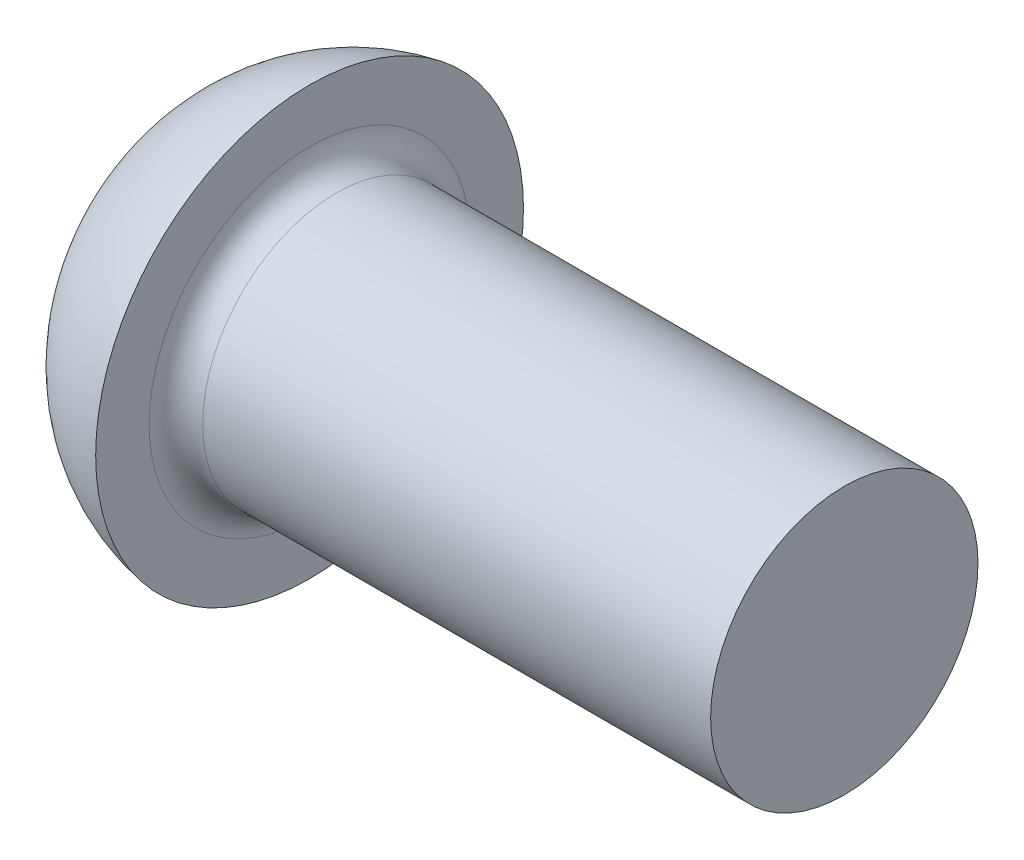
ISO-10303-21;
HEADER;
FILE_DESCRIPTION(('STEP AP214'),'2;1');
FILE_NAME('part.step','',(''),(''),'','','');
FILE_SCHEMA(('AUTOMOTIVE_DESIGN { 1 0 10303 214 1 1 1 1 }'));
ENDSEC;
DATA;
#1=APPLICATION_CONTEXT('core data for automotive mechanical design processes');
#2=APPLICATION_PROTOCOL_DEFINITION('international standard','automotive_design',2000,#1);
#3=PRODUCT_CONTEXT('',#1,'mechanical');
#4=PRODUCT('Part','Part','',(#3));
#5=PRODUCT_RELATED_PRODUCT_CATEGORY('part','',(#4));
#6=PRODUCT_DEFINITION_FORMATION('','',#4);
#7=PRODUCT_DEFINITION_CONTEXT('part definition',#1,'design');
#8=PRODUCT_DEFINITION('design','',#6,#7);
#9=PRODUCT_DEFINITION_SHAPE('','',#8);
#10=(LENGTH_UNIT() NAMED_UNIT(*) SI_UNIT(.MILLI.,.METRE.));
#11=(NAMED_UNIT(*) PLANE_ANGLE_UNIT() SI_UNIT($,.RADIAN.));
#12=(NAMED_UNIT(*) SI_UNIT($,.STERADIAN.) SOLID_ANGLE_UNIT());
#13=UNCERTAINTY_MEASURE_WITH_UNIT(LENGTH_MEASURE(1.E-05),#10,'distance_accuracy_value','');
#14=(GEOMETRIC_REPRESENTATION_CONTEXT(3) GLOBAL_UNCERTAINTY_ASSIGNED_CONTEXT((#13)) GLOBAL_UNIT_ASSIGNED_CONTEXT((#10,
#11,#12)) REPRESENTATION_CONTEXT('',''));
#15=CARTESIAN_POINT('',(0.,0.,0.));
#16=DIRECTION('',(0.,0.,1.));
#17=DIRECTION('',(1.,0.,0.));
#18=AXIS2_PLACEMENT_3D('',#15,#16,#17);
#19=CARTESIAN_POINT('',(2.3,0.,0.));
#20=DIRECTION('',(-1.,0.,0.));
#21=DIRECTION('',(0.,0.,-1.));
#22=AXIS2_PLACEMENT_3D('',#19,#20,#21);
#23=SPHERICAL_SURFACE('',#22,2.3);
#24=CARTESIAN_POINT('',(0.0688206815239022,0.,0.));
#25=DIRECTION('',(-1.,0.,0.));
#26=DIRECTION('',(0.,0.,1.));
#27=AXIS2_PLACEMENT_3D('',#24,#25,#26);
#28=CIRCLE('',#27,0.558425329658794);
#29=CARTESIAN_POINT('',(0.0688206815239016,0.297667956568125,0.472475011441971));
#30=VERTEX_POINT('',#29);
#31=CARTESIAN_POINT('',(0.0688206815238813,0.472475011441979,0.297667956568129));
#32=VERTEX_POINT('',#31);
#33=EDGE_CURVE('E264',#30,#32,#28,.T.);
#34=ORIENTED_EDGE('',*,*,#33,.T.);
#35=CARTESIAN_POINT('',(2.26227185569207,0.,-0.175058589588808));
#36=DIRECTION('',(0.210679975619373,0.,0.977555086873891));
#37=DIRECTION('',(0.977555086873891,0.,-0.210679975619373));
#38=AXIS2_PLACEMENT_3D('',#35,#36,#37);
#39=CIRCLE('',#38,2.29301789730003);
#40=CARTESIAN_POINT('',(0.0404779458236804,0.303776304779379,0.303776304779379));
#41=VERTEX_POINT('',#40);
#42=EDGE_CURVE('E256',#32,#41,#39,.T.);
#43=ORIENTED_EDGE('',*,*,#42,.T.);
#44=CARTESIAN_POINT('',(2.26227185569207,-0.175058589588808,0.));
#45=DIRECTION('',(0.210679975619373,0.977555086873891,0.));
#46=DIRECTION('',(-0.977555086873891,0.210679975619373,0.));
#47=AXIS2_PLACEMENT_3D('',#44,#45,#46);
#48=CIRCLE('',#47,2.29301789730003);
#49=EDGE_CURVE('E222',#41,#30,#48,.T.);
#50=ORIENTED_EDGE('',*,*,#49,.T.);
#51=EDGE_LOOP('',(#34,#43,#50));
#52=FACE_BOUND('',#51,.T.);
#53=ADVANCED_FACE('F48',(#52),#23,.T.);
#54=CARTESIAN_POINT('',(2.26227185569207,-0.175058589588808,0.));
#55=DIRECTION('',(0.210679975619373,0.977555086873891,0.));
#56=DIRECTION('',(-0.977555086873891,0.210679975619373,0.));
#57=AXIS2_PLACEMENT_3D('',#54,#55,#56);
#58=CIRCLE('',#57,2.29301789730003);
#59=CARTESIAN_POINT('',(0.0688206815238814,0.297667956568129,-0.472475011441979));
#60=VERTEX_POINT('',#59);
#61=CARTESIAN_POINT('',(0.0404779458236804,0.303776304779379,-0.303776304779379));
#62=VERTEX_POINT('',#61);
#63=EDGE_CURVE('E252',#60,#62,#58,.T.);
#64=ORIENTED_EDGE('',*,*,#63,.T.);
#65=CARTESIAN_POINT('',(2.26227185569207,0.,0.175058589588808));
#66=DIRECTION('',(0.210679975619373,0.,-0.977555086873891));
#67=DIRECTION('',(-0.977555086873891,0.,-0.210679975619373));
#68=AXIS2_PLACEMENT_3D('',#65,#66,#67);
#69=CIRCLE('',#68,2.29301789730003);
#70=CARTESIAN_POINT('',(0.0688206815239016,0.472475011441971,-0.297667956568125));
#71=VERTEX_POINT('',#70);
#72=EDGE_CURVE('E201',#62,#71,#69,.T.);
#73=ORIENTED_EDGE('',*,*,#72,.T.);
#74=EDGE_CURVE('E268',#71,#60,#28,.T.);
#75=ORIENTED_EDGE('',*,*,#74,.T.);
#76=EDGE_LOOP('',(#64,#73,#75));
#77=FACE_BOUND('',#76,.T.);
#78=ADVANCED_FACE('F315',(#77),#23,.T.);
#79=CARTESIAN_POINT('',(2.26227185569207,0.,0.175058589588808));
#80=DIRECTION('',(0.210679975619373,0.,-0.977555086873891));
#81=DIRECTION('',(-0.977555086873891,0.,-0.210679975619373));
#82=AXIS2_PLACEMENT_3D('',#79,#80,#81);
#83=CIRCLE('',#82,2.29301789730003);
#84=CARTESIAN_POINT('',(0.0688206815238813,-0.472475011441979,-0.297667956568129));
#85=VERTEX_POINT('',#84);
#86=CARTESIAN_POINT('',(0.0404779458236804,-0.303776304779379,-0.303776304779379));
#87=VERTEX_POINT('',#86);
#88=EDGE_CURVE('E249',#85,#87,#83,.T.);
#89=ORIENTED_EDGE('',*,*,#88,.T.);
#90=CARTESIAN_POINT('',(2.26227185569207,0.175058589588808,0.));
#91=DIRECTION('',(0.210679975619373,-0.977555086873891,0.));
#92=DIRECTION('',(0.977555086873891,0.210679975619373,0.));
#93=AXIS2_PLACEMENT_3D('',#90,#91,#92);
#94=CIRCLE('',#93,2.29301789730003);
#95=CARTESIAN_POINT('',(0.0688206815239016,-0.297667956568125,-0.472475011441971));
#96=VERTEX_POINT('',#95);
#97=EDGE_CURVE('E175',#87,#96,#94,.T.);
#98=ORIENTED_EDGE('',*,*,#97,.T.);
#99=EDGE_CURVE('E331',#96,#85,#28,.T.);
#100=ORIENTED_EDGE('',*,*,#99,.T.);
#101=EDGE_LOOP('',(#89,#98,#100));
#102=FACE_BOUND('',#101,.T.);
#103=ADVANCED_FACE('F302',(#102),#23,.T.);
#104=CARTESIAN_POINT('',(-13.6292682926829,0.,0.));
#105=DIRECTION('',(-1.,0.,0.));
#106=DIRECTION('',(0.,0.,1.));
#107=AXIS2_PLACEMENT_3D('',#104,#105,#106);
#108=CYLINDRICAL_SURFACE('',#107,1.);
#109=CARTESIAN_POINT('',(1.4,0.,0.));
#110=DIRECTION('',(-1.,0.,0.));
#111=DIRECTION('',(0.,0.,1.));
#112=AXIS2_PLACEMENT_3D('',#109,#110,#111);
#113=CIRCLE('',#112,1.);
#114=CARTESIAN_POINT('',(1.4,0.,1.));
#115=VERTEX_POINT('',#114);
#116=EDGE_CURVE('E271',#115,#115,#113,.F.);
#117=ORIENTED_EDGE('',*,*,#116,.T.);
#118=EDGE_LOOP('',(#117));
#119=FACE_BOUND('',#118,.T.);
#120=CARTESIAN_POINT('',(5.19982546707303,0.,0.));
#121=DIRECTION('',(-1.,0.,0.));
#122=DIRECTION('',(0.,0.,1.));
#123=AXIS2_PLACEMENT_3D('',#120,#121,#122);
#124=CIRCLE('',#123,1.);
#125=CARTESIAN_POINT('',(5.19982546707303,0.,1.));
#126=VERTEX_POINT('',#125);
#127=EDGE_CURVE('E258',#126,#126,#124,.F.);
#128=ORIENTED_EDGE('',*,*,#127,.F.);
#129=EDGE_LOOP('',(#128));
#130=FACE_BOUND('',#129,.T.);
#131=ADVANCED_FACE('F299',(#119,#130),#108,.T.);
#132=CARTESIAN_POINT('',(2.26227185569207,0.175058589588808,0.));
#133=DIRECTION('',(0.210679975619373,-0.977555086873891,0.));
#134=DIRECTION('',(0.977555086873891,0.210679975619373,0.));
#135=AXIS2_PLACEMENT_3D('',#132,#133,#134);
#136=CIRCLE('',#135,2.29301789730003);
#137=CARTESIAN_POINT('',(0.0688206815238814,-0.297667956568129,0.472475011441979));
#138=VERTEX_POINT('',#137);
#139=CARTESIAN_POINT('',(0.0404779458236804,-0.303776304779379,0.303776304779379));
#140=VERTEX_POINT('',#139);
#141=EDGE_CURVE('E223',#138,#140,#136,.T.);
#142=ORIENTED_EDGE('',*,*,#141,.T.);
#143=CARTESIAN_POINT('',(2.26227185569207,0.,-0.175058589588808));
#144=DIRECTION('',(0.210679975619373,0.,0.977555086873891));
#145=DIRECTION('',(0.977555086873891,0.,-0.210679975619373));
#146=AXIS2_PLACEMENT_3D('',#143,#144,#145);
#147=CIRCLE('',#146,2.29301789730003);
#148=CARTESIAN_POINT('',(0.0688206815239016,-0.472475011441971,0.297667956568125));
#149=VERTEX_POINT('',#148);
#150=EDGE_CURVE('E149',#140,#149,#147,.T.);
#151=ORIENTED_EDGE('',*,*,#150,.T.);
#152=EDGE_CURVE('E263',#149,#138,#28,.T.);
#153=ORIENTED_EDGE('',*,*,#152,.T.);
#154=EDGE_LOOP('',(#142,#151,#153));
#155=FACE_BOUND('',#154,.T.);
#156=ADVANCED_FACE('F301',(#155),#23,.T.);
#157=CARTESIAN_POINT('',(1.42692983190066,0.,0.));
#158=DIRECTION('',(-1.,0.,0.));
#159=DIRECTION('',(0.,0.,1.));
#160=AXIS2_PLACEMENT_3D('',#157,#158,#159);
#161=DEGENERATE_TOROIDAL_SURFACE('',#160,0.218514259431702,1.4,.T.);
#162=CARTESIAN_POINT('',(0.301720237702394,0.989896346808281,-0.354690849623245));
#163=CARTESIAN_POINT('',(0.286533932561126,1.00298798917144,-0.257289254248569));
#164=CARTESIAN_POINT('',(0.277695585046814,1.01060725426999,-0.158107853311676));
#165=CARTESIAN_POINT('',(0.27274819201924,1.01487224825928,0.0391486782301332));
#166=CARTESIAN_POINT('',(0.276429254809976,1.01169891826726,0.13721466233738));
#167=CARTESIAN_POINT('',(0.290333480875923,0.999712516486273,0.274546189569836));
#168=CARTESIAN_POINT('',(0.295493535037631,0.995264193933076,0.314771543384874));
#169=CARTESIAN_POINT('',(0.301720237702395,0.989896346808281,0.354690849623245));
#170=B_SPLINE_CURVE_WITH_KNOTS('',3,(#162,#163,#164,#165,#166,#167,#168,#169),.UNSPECIFIED.,.F.,
.F.,(4,2,2,4),(0.,0.298104156457715,0.591235313101563,0.713527508096115),.UNSPECIFIED.);
#171=CARTESIAN_POINT('',(0.287952001364803,1.00176551606483,-0.250441379016206));
#172=VERTEX_POINT('',#171);
#173=CARTESIAN_POINT('',(0.287952001364736,1.00176551606488,0.250441379016221));
#174=VERTEX_POINT('',#173);
#175=EDGE_CURVE('E62',#172,#174,#170,.T.);
#176=ORIENTED_EDGE('',*,*,#175,.T.);
#177=CARTESIAN_POINT('',(0.546215031099412,1.29219084961822,0.19478124329754));
#178=CARTESIAN_POINT('',(0.495084062914243,1.2487209825283,0.205800848509861));
#179=CARTESIAN_POINT('',(0.447087766281502,1.20146588828483,0.216144877956573));
#180=CARTESIAN_POINT('',(0.35844822394899,1.10075133035321,0.2352482275972));
#181=CARTESIAN_POINT('',(0.317761032659918,1.04733235294551,0.244017018823294));
#182=CARTESIAN_POINT('',(0.23758137148016,0.925044557308722,0.261297118215483));
#183=CARTESIAN_POINT('',(0.199605783002029,0.855121667762897,0.269481512284045));
#184=CARTESIAN_POINT('',(0.151373309753195,0.746108651585183,0.279876441863536));
#185=CARTESIAN_POINT('',(0.13672358026875,0.708977935366981,0.283033711148976));
#186=CARTESIAN_POINT('',(0.110413120830939,0.633635257646785,0.288704068786436));
#187=CARTESIAN_POINT('',(0.0987510443999045,0.595423791870279,0.291217447327607));
#188=CARTESIAN_POINT('',(0.075743564735886,0.508090568975157,0.296175955875887));
#189=CARTESIAN_POINT('',(0.0652765219174764,0.458726030874286,0.298431784069509));
#190=CARTESIAN_POINT('',(0.048802887742279,0.359163452673749,0.30198213626244));
#191=CARTESIAN_POINT('',(0.0428034684570555,0.308964204058498,0.303275114556669));
#192=CARTESIAN_POINT('',(0.0345094157851353,0.208536086577301,0.305062625908376));
#193=CARTESIAN_POINT('',(0.0321959513100959,0.158308688274607,0.305561217390066));
#194=CARTESIAN_POINT('',(0.0303098398199903,0.0830351955440955,0.305967706935347));
#195=CARTESIAN_POINT('',(0.0299444022038154,0.0579997168695667,0.306046465042281));
#196=CARTESIAN_POINT('',(0.0296219081266574,0.0079374001130797,0.306115968076151));
#197=CARTESIAN_POINT('',(0.0296646605617753,-0.0170894365270729,0.306106754189273));
#198=CARTESIAN_POINT('',(0.0298538253642405,-0.0421158496232382,0.306065985912879));
#199=B_SPLINE_CURVE_WITH_KNOTS('',3,(#177,#178,#179,#180,#181,#182,#183,#184,#185,#186,#187,
#188,#189,#190,#191,#192,#193,#194,#195,#196,#197,#198),.UNSPECIFIED.,.F.,.F.,(4,2,2,2,2,2,2,2,
2,2,4),(0.,0.203771994692184,0.406274521306972,0.645016878886515,0.765032026294032,
0.884992989655034,1.03628766454368,1.18782469887906,1.33858503773722,1.41369878470863,
1.48877736711459),.UNSPECIFIED.);
#200=EDGE_CURVE('E12',#174,#32,#199,.T.);
#201=ORIENTED_EDGE('',*,*,#200,.T.);
#202=ORIENTED_EDGE('',*,*,#33,.F.);
#203=CARTESIAN_POINT('',(0.0298538253642404,0.306065985912879,-0.0421158496232382));
#204=CARTESIAN_POINT('',(0.0296597351263702,0.306107815705524,-0.0164148610166974));
#205=CARTESIAN_POINT('',(0.0296202685708648,0.306116321428693,0.009289191848258));
#206=CARTESIAN_POINT('',(0.0299742848720708,0.306040024812054,0.0607004434957153));
#207=CARTESIAN_POINT('',(0.030367879389421,0.305955198407452,0.0864076413799024));
#208=CARTESIAN_POINT('',(0.0317169006896084,0.305664461058274,0.13799835475493));
#209=CARTESIAN_POINT('',(0.0326764469500459,0.305457662295249,0.163881773315615));
#210=CARTESIAN_POINT('',(0.0353860291755155,0.304873700608725,0.215608788448015));
#211=CARTESIAN_POINT('',(0.037136160606431,0.304496517110683,0.241452379832184));
#212=CARTESIAN_POINT('',(0.0434594709391539,0.303133734711389,0.31427490513106));
#213=CARTESIAN_POINT('',(0.0491706500921612,0.30190287713531,0.361161474034462));
#214=CARTESIAN_POINT('',(0.0645036449588233,0.298598352379564,0.454274483228951));
#215=CARTESIAN_POINT('',(0.0741256960622909,0.296524634469334,0.500500883612048));
#216=CARTESIAN_POINT('',(0.097473516924429,0.291492776524907,0.591717337234977));
#217=CARTESIAN_POINT('',(0.111186743139831,0.288537339840554,0.63671071701561));
#218=CARTESIAN_POINT('',(0.142748128615464,0.281735317108736,0.725157582998995));
#219=CARTESIAN_POINT('',(0.160597563783367,0.277888456081171,0.768610589259947));
#220=CARTESIAN_POINT('',(0.218206437418098,0.265472750556444,0.89165124534143));
#221=CARTESIAN_POINT('',(0.263265654503807,0.255761712391421,0.968723428059162));
#222=CARTESIAN_POINT('',(0.366677833954762,0.233474604751129,1.11281784965027));
#223=CARTESIAN_POINT('',(0.425018517677913,0.220901181534932,1.1798492768364));
#224=CARTESIAN_POINT('',(0.507536476076978,0.203117138776513,1.25834926713606));
#225=CARTESIAN_POINT('',(0.526654087510435,0.198996963898613,1.27555323845722));
#226=CARTESIAN_POINT('',(0.546215031099413,0.19478124329754,1.29219084961822));
#227=B_SPLINE_CURVE_WITH_KNOTS('',3,(#203,#204,#205,#206,#207,#208,#209,#210,#211,#212,#213,
#214,#215,#216,#217,#218,#219,#220,#221,#222,#223,#224,#225,#226),.UNSPECIFIED.,.F.,.F.,(4,2,2,
2,2,2,2,2,2,2,2,4),(0.,0.0771073746877959,0.154234635431697,0.231930345259727,0.309635439621426,
0.451226912570679,0.592826908971331,0.733997145086977,0.875210986477107,1.14297725862398,
1.41049698045582,1.48859467102794),.UNSPECIFIED.);
#228=CARTESIAN_POINT('',(0.287952001364349,0.250441379016304,1.00176551606522));
#229=VERTEX_POINT('',#228);
#230=EDGE_CURVE('E367',#30,#229,#227,.T.);
#231=ORIENTED_EDGE('',*,*,#230,.T.);
#232=CARTESIAN_POINT('',(0.301720237702394,0.354690849623245,0.989896346808281));
#233=CARTESIAN_POINT('',(0.286533932561126,0.257289254248568,1.00298798917144));
#234=CARTESIAN_POINT('',(0.277695585046814,0.158107853311675,1.01060725426999));
#235=CARTESIAN_POINT('',(0.27274819201924,-0.0391486782301336,1.01487224825928));
#236=CARTESIAN_POINT('',(0.276429254809976,-0.13721466233738,1.01169891826726));
#237=CARTESIAN_POINT('',(0.290333480875923,-0.274546189569836,0.999712516486273));
#238=CARTESIAN_POINT('',(0.295493535037631,-0.314771543384874,0.995264193933076));
#239=CARTESIAN_POINT('',(0.301720237702395,-0.354690849623245,0.989896346808281));
#240=B_SPLINE_CURVE_WITH_KNOTS('',3,(#232,#233,#234,#235,#236,#237,#238,#239),.UNSPECIFIED.,.F.,
.F.,(4,2,2,4),(0.,0.298104156457715,0.591235313101563,0.713527508096114),.UNSPECIFIED.);
#241=CARTESIAN_POINT('',(0.287952001364736,-0.25044137901622,1.00176551606488));
#242=VERTEX_POINT('',#241);
#243=EDGE_CURVE('E226',#229,#242,#240,.T.);
#244=ORIENTED_EDGE('',*,*,#243,.T.);
#245=CARTESIAN_POINT('',(0.546215031099412,-0.19478124329754,1.29219084961822));
#246=CARTESIAN_POINT('',(0.495084062914243,-0.205800848509861,1.2487209825283));
#247=CARTESIAN_POINT('',(0.447087766281503,-0.216144877956572,1.20146588828483));
#248=CARTESIAN_POINT('',(0.358448223948991,-0.2352482275972,1.10075133035321));
#249=CARTESIAN_POINT('',(0.317761032659918,-0.244017018823293,1.04733235294551));
#250=CARTESIAN_POINT('',(0.23758137148016,-0.261297118215483,0.925044557308722));
#251=CARTESIAN_POINT('',(0.199605783002029,-0.269481512284045,0.855121667762897));
#252=CARTESIAN_POINT('',(0.151373309753195,-0.279876441863535,0.746108651585183));
#253=CARTESIAN_POINT('',(0.13672358026875,-0.283033711148976,0.708977935366981));
#254=CARTESIAN_POINT('',(0.110413120830939,-0.288704068786435,0.633635257646785));
#255=CARTESIAN_POINT('',(0.0987510443999044,-0.291217447327607,0.595423791870279));
#256=CARTESIAN_POINT('',(0.0757435647358859,-0.296175955875887,0.508090568975157));
#257=CARTESIAN_POINT('',(0.0652765219174763,-0.298431784069509,0.458726030874287));
#258=CARTESIAN_POINT('',(0.048802887742279,-0.30198213626244,0.359163452673749));
#259=CARTESIAN_POINT('',(0.0428034684570556,-0.303275114556669,0.308964204058498));
#260=CARTESIAN_POINT('',(0.0345094157851354,-0.305062625908376,0.208536086577301));
#261=CARTESIAN_POINT('',(0.032195951310096,-0.305561217390065,0.158308688274608));
#262=CARTESIAN_POINT('',(0.0303098398199903,-0.305967706935347,0.0830351955440954));
#263=CARTESIAN_POINT('',(0.0299444022038153,-0.306046465042281,0.0579997168695665));
#264=CARTESIAN_POINT('',(0.0296219081266573,-0.306115968076151,0.00793740011307953));
#265=CARTESIAN_POINT('',(0.0296646605617753,-0.306106754189272,-0.017089436527073));
#266=CARTESIAN_POINT('',(0.0298538253642405,-0.306065985912879,-0.0421158496232384));
#267=B_SPLINE_CURVE_WITH_KNOTS('',3,(#245,#246,#247,#248,#249,#250,#251,#252,#253,#254,#255,
#256,#257,#258,#259,#260,#261,#262,#263,#264,#265,#266),.UNSPECIFIED.,.F.,.F.,(4,2,2,2,2,2,2,2,
2,2,4),(0.,0.203771994692184,0.406274521306972,0.645016878886515,0.765032026294032,
0.884992989655034,1.03628766454368,1.18782469887906,1.33858503773722,1.41369878470864,
1.48877736711459),.UNSPECIFIED.);
#268=EDGE_CURVE('E138',#242,#138,#267,.T.);
#269=ORIENTED_EDGE('',*,*,#268,.T.);
#270=ORIENTED_EDGE('',*,*,#152,.F.);
#271=CARTESIAN_POINT('',(0.0298538253642404,0.0421158496232382,0.306065985912879));
#272=CARTESIAN_POINT('',(0.0296597351263701,0.0164148610166974,0.306107815705524));
#273=CARTESIAN_POINT('',(0.0296202685708647,-0.009289191848258,0.306116321428693));
#274=CARTESIAN_POINT('',(0.0299742848720706,-0.0607004434957153,0.306040024812054));
#275=CARTESIAN_POINT('',(0.0303678793894208,-0.0864076413799023,0.305955198407452));
#276=CARTESIAN_POINT('',(0.0317169006896083,-0.13799835475493,0.305664461058274));
#277=CARTESIAN_POINT('',(0.0326764469500458,-0.163881773315615,0.305457662295249));
#278=CARTESIAN_POINT('',(0.0353860291755154,-0.215608788448015,0.304873700608725));
#279=CARTESIAN_POINT('',(0.037136160606431,-0.241452379832184,0.304496517110683));
#280=CARTESIAN_POINT('',(0.0434594709391539,-0.31427490513106,0.303133734711389));
#281=CARTESIAN_POINT('',(0.0491706500921611,-0.361161474034462,0.30190287713531));
#282=CARTESIAN_POINT('',(0.0645036449588231,-0.454274483228952,0.298598352379564));
#283=CARTESIAN_POINT('',(0.0741256960622908,-0.500500883612048,0.296524634469334));
#284=CARTESIAN_POINT('',(0.0974735169244291,-0.591717337234977,0.291492776524908));
#285=CARTESIAN_POINT('',(0.111186743139831,-0.63671071701561,0.288537339840554));
#286=CARTESIAN_POINT('',(0.142748128615464,-0.725157582998995,0.281735317108736));
#287=CARTESIAN_POINT('',(0.160597563783367,-0.768610589259947,0.277888456081171));
#288=CARTESIAN_POINT('',(0.218206437418098,-0.891651245341431,0.265472750556444));
#289=CARTESIAN_POINT('',(0.263265654503807,-0.968723428059162,0.255761712391421));
#290=CARTESIAN_POINT('',(0.366677833954763,-1.11281784965027,0.233474604751129));
#291=CARTESIAN_POINT('',(0.425018517677913,-1.1798492768364,0.220901181534932));
#292=CARTESIAN_POINT('',(0.507536476076978,-1.25834926713606,0.203117138776513));
#293=CARTESIAN_POINT('',(0.526654087510435,-1.27555323845722,0.198996963898613));
#294=CARTESIAN_POINT('',(0.546215031099412,-1.29219084961822,0.19478124329754));
#295=B_SPLINE_CURVE_WITH_KNOTS('',3,(#271,#272,#273,#274,#275,#276,#277,#278,#279,#280,#281,
#282,#283,#284,#285,#286,#287,#288,#289,#290,#291,#292,#293,#294),.UNSPECIFIED.,.F.,.F.,(4,2,2,
2,2,2,2,2,2,2,2,4),(0.,0.0771073746877959,0.154234635431697,0.231930345259727,0.309635439621426,
0.451226912570679,0.592826908971331,0.733997145086977,0.875210986477107,1.14297725862398,
1.41049698045582,1.48859467102794),.UNSPECIFIED.);
#296=CARTESIAN_POINT('',(0.287952001364803,-1.00176551606483,0.250441379016206));
#297=VERTEX_POINT('',#296);
#298=EDGE_CURVE('E336',#149,#297,#295,.T.);
#299=ORIENTED_EDGE('',*,*,#298,.T.);
#300=CARTESIAN_POINT('',(0.301720237702394,-0.989896346808281,0.354690849623245));
#301=CARTESIAN_POINT('',(0.286533932561126,-1.00298798917144,0.257289254248569));
#302=CARTESIAN_POINT('',(0.277695585046814,-1.01060725426999,0.158107853311676));
#303=CARTESIAN_POINT('',(0.27274819201924,-1.01487224825928,-0.0391486782301332));
#304=CARTESIAN_POINT('',(0.276429254809976,-1.01169891826726,-0.13721466233738));
#305=CARTESIAN_POINT('',(0.290333480875923,-0.999712516486273,-0.274546189569836));
#306=CARTESIAN_POINT('',(0.295493535037631,-0.995264193933076,-0.314771543384874));
#307=CARTESIAN_POINT('',(0.301720237702395,-0.989896346808281,-0.354690849623245));
#308=B_SPLINE_CURVE_WITH_KNOTS('',3,(#300,#301,#302,#303,#304,#305,#306,#307),.UNSPECIFIED.,.F.,
.F.,(4,2,2,4),(0.,0.298104156457715,0.591235313101563,0.713527508096115),.UNSPECIFIED.);
#309=CARTESIAN_POINT('',(0.287952001364736,-1.00176551606488,-0.250441379016221));
#310=VERTEX_POINT('',#309);
#311=EDGE_CURVE('E157',#297,#310,#308,.T.);
#312=ORIENTED_EDGE('',*,*,#311,.T.);
#313=CARTESIAN_POINT('',(0.546215031099412,-1.29219084961822,-0.19478124329754));
#314=CARTESIAN_POINT('',(0.495084062914243,-1.2487209825283,-0.205800848509861));
#315=CARTESIAN_POINT('',(0.447087766281502,-1.20146588828483,-0.216144877956573));
#316=CARTESIAN_POINT('',(0.35844822394899,-1.10075133035321,-0.2352482275972));
#317=CARTESIAN_POINT('',(0.317761032659918,-1.04733235294551,-0.244017018823294));
#318=CARTESIAN_POINT('',(0.23758137148016,-0.925044557308722,-0.261297118215483));
#319=CARTESIAN_POINT('',(0.199605783002029,-0.855121667762897,-0.269481512284045));
#320=CARTESIAN_POINT('',(0.151373309753195,-0.746108651585183,-0.279876441863536));
#321=CARTESIAN_POINT('',(0.13672358026875,-0.708977935366981,-0.283033711148976));
#322=CARTESIAN_POINT('',(0.110413120830939,-0.633635257646785,-0.288704068786436));
#323=CARTESIAN_POINT('',(0.0987510443999045,-0.595423791870279,-0.291217447327607));
#324=CARTESIAN_POINT('',(0.075743564735886,-0.508090568975157,-0.296175955875887));
#325=CARTESIAN_POINT('',(0.0652765219174764,-0.458726030874286,-0.298431784069509));
#326=CARTESIAN_POINT('',(0.048802887742279,-0.359163452673749,-0.30198213626244));
#327=CARTESIAN_POINT('',(0.0428034684570555,-0.308964204058498,-0.303275114556669));
#328=CARTESIAN_POINT('',(0.0345094157851353,-0.208536086577301,-0.305062625908376));
#329=CARTESIAN_POINT('',(0.0321959513100959,-0.158308688274607,-0.305561217390066));
#330=CARTESIAN_POINT('',(0.0303098398199903,-0.0830351955440955,-0.305967706935347));
#331=CARTESIAN_POINT('',(0.0299444022038154,-0.0579997168695667,-0.306046465042281));
#332=CARTESIAN_POINT('',(0.0296219081266574,-0.0079374001130797,-0.306115968076151));
#333=CARTESIAN_POINT('',(0.0296646605617753,0.0170894365270729,-0.306106754189273));
#334=CARTESIAN_POINT('',(0.0298538253642405,0.0421158496232382,-0.306065985912879));
#335=B_SPLINE_CURVE_WITH_KNOTS('',3,(#313,#314,#315,#316,#317,#318,#319,#320,#321,#322,#323,
#324,#325,#326,#327,#328,#329,#330,#331,#332,#333,#334),.UNSPECIFIED.,.F.,.F.,(4,2,2,2,2,2,2,2,
2,2,4),(0.,0.203771994692184,0.406274521306972,0.645016878886515,0.765032026294032,
0.884992989655034,1.03628766454368,1.18782469887906,1.33858503773722,1.41369878470863,
1.48877736711459),.UNSPECIFIED.);
#336=EDGE_CURVE('E166',#310,#85,#335,.T.);
#337=ORIENTED_EDGE('',*,*,#336,.T.);
#338=ORIENTED_EDGE('',*,*,#99,.F.);
#339=CARTESIAN_POINT('',(0.0298538253642404,-0.306065985912879,0.0421158496232382));
#340=CARTESIAN_POINT('',(0.0296597351263702,-0.306107815705524,0.0164148610166974));
#341=CARTESIAN_POINT('',(0.0296202685708648,-0.306116321428693,-0.009289191848258));
#342=CARTESIAN_POINT('',(0.0299742848720708,-0.306040024812054,-0.0607004434957153));
#343=CARTESIAN_POINT('',(0.030367879389421,-0.305955198407452,-0.0864076413799024));
#344=CARTESIAN_POINT('',(0.0317169006896084,-0.305664461058274,-0.13799835475493));
#345=CARTESIAN_POINT('',(0.0326764469500459,-0.305457662295249,-0.163881773315615));
#346=CARTESIAN_POINT('',(0.0353860291755155,-0.304873700608725,-0.215608788448015));
#347=CARTESIAN_POINT('',(0.037136160606431,-0.304496517110683,-0.241452379832184));
#348=CARTESIAN_POINT('',(0.0434594709391539,-0.303133734711389,-0.31427490513106));
#349=CARTESIAN_POINT('',(0.0491706500921612,-0.30190287713531,-0.361161474034462));
#350=CARTESIAN_POINT('',(0.0645036449588233,-0.298598352379564,-0.454274483228951));
#351=CARTESIAN_POINT('',(0.0741256960622909,-0.296524634469334,-0.500500883612048));
#352=CARTESIAN_POINT('',(0.097473516924429,-0.291492776524907,-0.591717337234977));
#353=CARTESIAN_POINT('',(0.111186743139831,-0.288537339840554,-0.63671071701561));
#354=CARTESIAN_POINT('',(0.142748128615464,-0.281735317108736,-0.725157582998995));
#355=CARTESIAN_POINT('',(0.160597563783367,-0.277888456081171,-0.768610589259947));
#356=CARTESIAN_POINT('',(0.218206437418098,-0.265472750556444,-0.89165124534143));
#357=CARTESIAN_POINT('',(0.263265654503807,-0.255761712391421,-0.968723428059162));
#358=CARTESIAN_POINT('',(0.366677833954762,-0.233474604751129,-1.11281784965027));
#359=CARTESIAN_POINT('',(0.425018517677913,-0.220901181534932,-1.1798492768364));
#360=CARTESIAN_POINT('',(0.507536476076978,-0.203117138776513,-1.25834926713606));
#361=CARTESIAN_POINT('',(0.526654087510435,-0.198996963898613,-1.27555323845722));
#362=CARTESIAN_POINT('',(0.546215031099413,-0.19478124329754,-1.29219084961822));
#363=B_SPLINE_CURVE_WITH_KNOTS('',3,(#339,#340,#341,#342,#343,#344,#345,#346,#347,#348,#349,
#350,#351,#352,#353,#354,#355,#356,#357,#358,#359,#360,#361,#362),.UNSPECIFIED.,.F.,.F.,(4,2,2,
2,2,2,2,2,2,2,2,4),(0.,0.0771073746877959,0.154234635431697,0.231930345259727,0.309635439621426,
0.451226912570679,0.592826908971331,0.733997145086977,0.875210986477107,1.14297725862398,
1.41049698045582,1.48859467102794),.UNSPECIFIED.);
#364=CARTESIAN_POINT('',(0.287952001364802,-0.250441379016206,-1.00176551606483));
#365=VERTEX_POINT('',#364);
#366=EDGE_CURVE('E333',#96,#365,#363,.T.);
#367=ORIENTED_EDGE('',*,*,#366,.T.);
#368=CARTESIAN_POINT('',(0.301720237702394,-0.354690849623245,-0.989896346808281));
#369=CARTESIAN_POINT('',(0.286533932561126,-0.257289254248568,-1.00298798917144));
#370=CARTESIAN_POINT('',(0.277695585046814,-0.158107853311675,-1.01060725426999));
#371=CARTESIAN_POINT('',(0.27274819201924,0.0391486782301336,-1.01487224825928));
#372=CARTESIAN_POINT('',(0.276429254809976,0.13721466233738,-1.01169891826726));
#373=CARTESIAN_POINT('',(0.290333480875923,0.274546189569836,-0.999712516486273));
#374=CARTESIAN_POINT('',(0.295493535037631,0.314771543384874,-0.995264193933076));
#375=CARTESIAN_POINT('',(0.301720237702395,0.354690849623245,-0.989896346808281));
#376=B_SPLINE_CURVE_WITH_KNOTS('',3,(#368,#369,#370,#371,#372,#373,#374,#375),.UNSPECIFIED.,.F.,
.F.,(4,2,2,4),(0.,0.298104156457715,0.591235313101563,0.713527508096114),.UNSPECIFIED.);
#377=CARTESIAN_POINT('',(0.287952001364736,0.25044137901622,-1.00176551606488));
#378=VERTEX_POINT('',#377);
#379=EDGE_CURVE('E183',#365,#378,#376,.T.);
#380=ORIENTED_EDGE('',*,*,#379,.T.);
#381=CARTESIAN_POINT('',(0.546215031099412,0.19478124329754,-1.29219084961822));
#382=CARTESIAN_POINT('',(0.495084062914243,0.205800848509861,-1.2487209825283));
#383=CARTESIAN_POINT('',(0.447087766281503,0.216144877956572,-1.20146588828483));
#384=CARTESIAN_POINT('',(0.358448223948991,0.2352482275972,-1.10075133035321));
#385=CARTESIAN_POINT('',(0.317761032659918,0.244017018823293,-1.04733235294551));
#386=CARTESIAN_POINT('',(0.23758137148016,0.261297118215483,-0.925044557308722));
#387=CARTESIAN_POINT('',(0.199605783002029,0.269481512284045,-0.855121667762897));
#388=CARTESIAN_POINT('',(0.151373309753195,0.279876441863535,-0.746108651585183));
#389=CARTESIAN_POINT('',(0.13672358026875,0.283033711148976,-0.708977935366981));
#390=CARTESIAN_POINT('',(0.110413120830939,0.288704068786435,-0.633635257646785));
#391=CARTESIAN_POINT('',(0.0987510443999044,0.291217447327607,-0.595423791870279));
#392=CARTESIAN_POINT('',(0.0757435647358859,0.296175955875887,-0.508090568975157));
#393=CARTESIAN_POINT('',(0.0652765219174763,0.298431784069509,-0.458726030874287));
#394=CARTESIAN_POINT('',(0.048802887742279,0.30198213626244,-0.359163452673749));
#395=CARTESIAN_POINT('',(0.0428034684570556,0.303275114556669,-0.308964204058498));
#396=CARTESIAN_POINT('',(0.0345094157851354,0.305062625908376,-0.208536086577301));
#397=CARTESIAN_POINT('',(0.032195951310096,0.305561217390065,-0.158308688274608));
#398=CARTESIAN_POINT('',(0.0303098398199903,0.305967706935347,-0.0830351955440954));
#399=CARTESIAN_POINT('',(0.0299444022038153,0.306046465042281,-0.0579997168695665));
#400=CARTESIAN_POINT('',(0.0296219081266573,0.306115968076151,-0.00793740011307953));
#401=CARTESIAN_POINT('',(0.0296646605617753,0.306106754189272,0.017089436527073));
#402=CARTESIAN_POINT('',(0.0298538253642405,0.306065985912879,0.0421158496232384));
#403=B_SPLINE_CURVE_WITH_KNOTS('',3,(#381,#382,#383,#384,#385,#386,#387,#388,#389,#390,#391,
#392,#393,#394,#395,#396,#397,#398,#399,#400,#401,#402),.UNSPECIFIED.,.F.,.F.,(4,2,2,2,2,2,2,2,
2,2,4),(0.,0.203771994692184,0.406274521306972,0.645016878886515,0.765032026294032,
0.884992989655034,1.03628766454368,1.18782469887906,1.33858503773722,1.41369878470864,
1.48877736711459),.UNSPECIFIED.);
#404=EDGE_CURVE('E192',#378,#60,#403,.T.);
#405=ORIENTED_EDGE('',*,*,#404,.T.);
#406=ORIENTED_EDGE('',*,*,#74,.F.);
#407=CARTESIAN_POINT('',(0.0298538253642404,-0.0421158496232382,-0.306065985912879));
#408=CARTESIAN_POINT('',(0.0296597351263701,-0.0164148610166974,-0.306107815705524));
#409=CARTESIAN_POINT('',(0.0296202685708647,0.009289191848258,-0.306116321428693));
#410=CARTESIAN_POINT('',(0.0299742848720706,0.0607004434957153,-0.306040024812054));
#411=CARTESIAN_POINT('',(0.0303678793894208,0.0864076413799023,-0.305955198407452));
#412=CARTESIAN_POINT('',(0.0317169006896083,0.13799835475493,-0.305664461058274));
#413=CARTESIAN_POINT('',(0.0326764469500458,0.163881773315615,-0.305457662295249));
#414=CARTESIAN_POINT('',(0.0353860291755154,0.215608788448015,-0.304873700608725));
#415=CARTESIAN_POINT('',(0.037136160606431,0.241452379832184,-0.304496517110683));
#416=CARTESIAN_POINT('',(0.0434594709391539,0.31427490513106,-0.303133734711389));
#417=CARTESIAN_POINT('',(0.0491706500921611,0.361161474034462,-0.30190287713531));
#418=CARTESIAN_POINT('',(0.0645036449588231,0.454274483228952,-0.298598352379564));
#419=CARTESIAN_POINT('',(0.0741256960622908,0.500500883612048,-0.296524634469334));
#420=CARTESIAN_POINT('',(0.0974735169244291,0.591717337234977,-0.291492776524908));
#421=CARTESIAN_POINT('',(0.111186743139831,0.63671071701561,-0.288537339840554));
#422=CARTESIAN_POINT('',(0.142748128615464,0.725157582998995,-0.281735317108736));
#423=CARTESIAN_POINT('',(0.160597563783367,0.768610589259947,-0.277888456081171));
#424=CARTESIAN_POINT('',(0.218206437418098,0.891651245341431,-0.265472750556444));
#425=CARTESIAN_POINT('',(0.263265654503807,0.968723428059162,-0.255761712391421));
#426=CARTESIAN_POINT('',(0.366677833954763,1.11281784965027,-0.233474604751129));
#427=CARTESIAN_POINT('',(0.425018517677913,1.1798492768364,-0.220901181534932));
#428=CARTESIAN_POINT('',(0.507536476076978,1.25834926713606,-0.203117138776513));
#429=CARTESIAN_POINT('',(0.526654087510435,1.27555323845722,-0.198996963898613));
#430=CARTESIAN_POINT('',(0.546215031099412,1.29219084961822,-0.19478124329754));
#431=B_SPLINE_CURVE_WITH_KNOTS('',3,(#407,#408,#409,#410,#411,#412,#413,#414,#415,#416,#417,
#418,#419,#420,#421,#422,#423,#424,#425,#426,#427,#428,#429,#430),.UNSPECIFIED.,.F.,.F.,(4,2,2,
2,2,2,2,2,2,2,2,4),(0.,0.0771073746877959,0.154234635431697,0.231930345259727,0.309635439621426,
0.451226912570679,0.592826908971331,0.733997145086977,0.875210986477107,1.14297725862398,
1.41049698045582,1.48859467102794),.UNSPECIFIED.);
#432=EDGE_CURVE('E387',#71,#172,#431,.T.);
#433=ORIENTED_EDGE('',*,*,#432,.T.);
#434=EDGE_LOOP('',(#176,#201,#202,#231,#244,#269,#270,#299,#312,#337,#338,#367,#380,#405,#406,#433));
#435=FACE_BOUND('',#434,.T.);
#436=CARTESIAN_POINT('',(1.2,0.,0.));
#437=DIRECTION('',(-1.,0.,0.));
#438=DIRECTION('',(0.,0.,1.));
#439=AXIS2_PLACEMENT_3D('',#436,#437,#438);
#440=CIRCLE('',#439,1.6);
#441=CARTESIAN_POINT('',(1.2,0.,1.6));
#442=VERTEX_POINT('',#441);
#443=EDGE_CURVE('E259',#442,#442,#440,.T.);
#444=ORIENTED_EDGE('',*,*,#443,.T.);
#445=EDGE_LOOP('',(#444));
#446=FACE_BOUND('',#445,.T.);
#447=ADVANCED_FACE('F288',(#435,#446),#161,.T.);
#448=CARTESIAN_POINT('',(1.2,0.,-1.));
#449=DIRECTION('',(-1.,0.,0.));
#450=DIRECTION('',(0.,0.,1.));
#451=AXIS2_PLACEMENT_3D('',#448,#449,#450);
#452=PLANE('',#451);
#453=CARTESIAN_POINT('',(1.2,0.,0.));
#454=DIRECTION('',(-1.,0.,0.));
#455=DIRECTION('',(0.,0.,1.));
#456=AXIS2_PLACEMENT_3D('',#453,#454,#455);
#457=CIRCLE('',#456,1.2);
#458=CARTESIAN_POINT('',(1.2,0.,1.2));
#459=VERTEX_POINT('',#458);
#460=EDGE_CURVE('E267',#459,#459,#457,.T.);
#461=ORIENTED_EDGE('',*,*,#460,.T.);
#462=EDGE_LOOP('',(#461));
#463=FACE_BOUND('',#462,.T.);
#464=ORIENTED_EDGE('',*,*,#443,.F.);
#465=EDGE_LOOP('',(#464));
#466=FACE_BOUND('',#465,.T.);
#467=ADVANCED_FACE('F304',(#463,#466),#452,.F.);
#468=CARTESIAN_POINT('',(1.4,0.,0.));
#469=DIRECTION('',(-1.,0.,0.));
#470=DIRECTION('',(0.,0.,1.));
#471=AXIS2_PLACEMENT_3D('',#468,#469,#470);
#472=TOROIDAL_SURFACE('',#471,1.2,0.2);
#473=ORIENTED_EDGE('',*,*,#116,.F.);
#474=EDGE_LOOP('',(#473));
#475=FACE_BOUND('',#474,.T.);
#476=ORIENTED_EDGE('',*,*,#460,.F.);
#477=EDGE_LOOP('',(#476));
#478=FACE_BOUND('',#477,.T.);
#479=ADVANCED_FACE('F50',(#475,#478),#472,.F.);
#480=CARTESIAN_POINT('',(5.19633480853367,0.,0.));
#481=DIRECTION('',(-1.,0.,0.));
#482=DIRECTION('',(0.,0.,1.));
#483=AXIS2_PLACEMENT_3D('',#480,#481,#482);
#484=CONICAL_SURFACE('',#483,21.,1.5706217938697);
#485=CARTESIAN_POINT('',(5.2,0.,0.));
#486=VERTEX_POINT('',#485);
#487=VERTEX_LOOP('',#486);
#488=FACE_BOUND('',#487,.T.);
#489=ORIENTED_EDGE('',*,*,#127,.T.);
#490=EDGE_LOOP('',(#489));
#491=FACE_BOUND('',#490,.T.);
#492=ADVANCED_FACE('F296',(#488,#491),#484,.T.);
#493=CARTESIAN_POINT('',(0.,1.25,0.3125));
#494=DIRECTION('',(0.210679975619373,0.,0.977555086873891));
#495=DIRECTION('',(0.977555086873891,0.,-0.210679975619373));
#496=AXIS2_PLACEMENT_3D('',#493,#494,#495);
#497=PLANE('',#496);
#498=ORIENTED_EDGE('',*,*,#200,.F.);
#499=DIRECTION('',(-0.747516408869402,0.644410697301208,0.161102674325302));
#500=VECTOR('',#499,1.);
#501=CARTESIAN_POINT('',(1.45,0.,0.));
#502=LINE('',#501,#500);
#503=CARTESIAN_POINT('',(1.45,0.,0.));
#504=VERTEX_POINT('',#503);
#505=EDGE_CURVE('E207',#504,#174,#502,.T.);
#506=ORIENTED_EDGE('',*,*,#505,.F.);
#507=DIRECTION('',(-0.956556678924234,0.206154456664706,0.206154456664706));
#508=VECTOR('',#507,1.);
#509=CARTESIAN_POINT('',(1.45,0.,0.));
#510=LINE('',#509,#508);
#511=EDGE_CURVE('E214',#504,#41,#510,.T.);
#512=ORIENTED_EDGE('',*,*,#511,.T.);
#513=ORIENTED_EDGE('',*,*,#42,.F.);
#514=EDGE_LOOP('',(#498,#506,#512,#513));
#515=FACE_BOUND('',#514,.T.);
#516=ADVANCED_FACE('F213',(#515),#497,.F.);
#517=CARTESIAN_POINT('',(0.,0.3125,0.3125));
#518=DIRECTION('',(0.210679975619373,0.977555086873891,0.));
#519=DIRECTION('',(-0.977555086873891,0.210679975619373,0.));
#520=AXIS2_PLACEMENT_3D('',#517,#518,#519);
#521=PLANE('',#520);
#522=ORIENTED_EDGE('',*,*,#511,.F.);
#523=DIRECTION('',(-0.747516408869402,0.161102674325302,0.644410697301208));
#524=VECTOR('',#523,1.);
#525=CARTESIAN_POINT('',(1.45,0.,0.));
#526=LINE('',#525,#524);
#527=EDGE_CURVE('E140',#504,#229,#526,.T.);
#528=ORIENTED_EDGE('',*,*,#527,.T.);
#529=ORIENTED_EDGE('',*,*,#230,.F.);
#530=ORIENTED_EDGE('',*,*,#49,.F.);
#531=EDGE_LOOP('',(#522,#528,#529,#530));
#532=FACE_BOUND('',#531,.T.);
#533=ADVANCED_FACE('F219',(#532),#521,.F.);
#534=CARTESIAN_POINT('',(0.,1.25,-0.3125));
#535=DIRECTION('',(0.652939622069463,0.757409961600577,0.));
#536=DIRECTION('',(-0.757409961600577,0.652939622069463,0.));
#537=AXIS2_PLACEMENT_3D('',#534,#535,#536);
#538=PLANE('',#537);
#539=DIRECTION('',(-0.747516408869402,0.644410697301208,-0.161102674325302));
#540=VECTOR('',#539,1.);
#541=CARTESIAN_POINT('',(1.45,0.,0.));
#542=LINE('',#541,#540);
#543=EDGE_CURVE('E198',#504,#172,#542,.T.);
#544=ORIENTED_EDGE('',*,*,#543,.F.);
#545=ORIENTED_EDGE('',*,*,#505,.T.);
#546=ORIENTED_EDGE('',*,*,#175,.F.);
#547=EDGE_LOOP('',(#544,#545,#546));
#548=FACE_BOUND('',#547,.T.);
#549=ADVANCED_FACE('F206',(#548),#538,.F.);
#550=CARTESIAN_POINT('',(0.,0.3125,-0.3125));
#551=DIRECTION('',(0.210679975619373,0.,-0.977555086873891));
#552=DIRECTION('',(-0.977555086873891,0.,-0.210679975619373));
#553=AXIS2_PLACEMENT_3D('',#550,#551,#552);
#554=PLANE('',#553);
#555=DIRECTION('',(-0.956556678924234,0.206154456664706,-0.206154456664706));
#556=VECTOR('',#555,1.);
#557=CARTESIAN_POINT('',(1.45,0.,0.));
#558=LINE('',#557,#556);
#559=EDGE_CURVE('E189',#504,#62,#558,.T.);
#560=ORIENTED_EDGE('',*,*,#559,.F.);
#561=ORIENTED_EDGE('',*,*,#543,.T.);
#562=ORIENTED_EDGE('',*,*,#432,.F.);
#563=ORIENTED_EDGE('',*,*,#72,.F.);
#564=EDGE_LOOP('',(#560,#561,#562,#563));
#565=FACE_BOUND('',#564,.T.);
#566=ADVANCED_FACE('F197',(#565),#554,.F.);
#567=CARTESIAN_POINT('',(0.,0.3125,-1.25));
#568=DIRECTION('',(0.210679975619373,0.977555086873891,0.));
#569=DIRECTION('',(-0.977555086873891,0.210679975619373,0.));
#570=AXIS2_PLACEMENT_3D('',#567,#568,#569);
#571=PLANE('',#570);
#572=ORIENTED_EDGE('',*,*,#404,.F.);
#573=DIRECTION('',(-0.747516408869402,0.161102674325302,-0.644410697301208));
#574=VECTOR('',#573,1.);
#575=CARTESIAN_POINT('',(1.45,0.,0.));
#576=LINE('',#575,#574);
#577=EDGE_CURVE('E181',#504,#378,#576,.T.);
#578=ORIENTED_EDGE('',*,*,#577,.F.);
#579=ORIENTED_EDGE('',*,*,#559,.T.);
#580=ORIENTED_EDGE('',*,*,#63,.F.);
#581=EDGE_LOOP('',(#572,#578,#579,#580));
#582=FACE_BOUND('',#581,.T.);
#583=ADVANCED_FACE('F188',(#582),#571,.F.);
#584=CARTESIAN_POINT('',(0.,-0.3125,-1.25));
#585=DIRECTION('',(0.652939622069463,0.,-0.757409961600577));
#586=DIRECTION('',(-0.757409961600577,0.,-0.652939622069463));
#587=AXIS2_PLACEMENT_3D('',#584,#585,#586);
#588=PLANE('',#587);
#589=DIRECTION('',(-0.747516408869402,-0.161102674325302,-0.644410697301208));
#590=VECTOR('',#589,1.);
#591=CARTESIAN_POINT('',(1.45,0.,0.));
#592=LINE('',#591,#590);
#593=EDGE_CURVE('E172',#504,#365,#592,.T.);
#594=ORIENTED_EDGE('',*,*,#593,.F.);
#595=ORIENTED_EDGE('',*,*,#577,.T.);
#596=ORIENTED_EDGE('',*,*,#379,.F.);
#597=EDGE_LOOP('',(#594,#595,#596));
#598=FACE_BOUND('',#597,.T.);
#599=ADVANCED_FACE('F180',(#598),#588,.F.);
#600=CARTESIAN_POINT('',(0.,-0.3125,-0.3125));
#601=DIRECTION('',(0.210679975619373,-0.977555086873891,0.));
#602=DIRECTION('',(0.977555086873891,0.210679975619373,0.));
#603=AXIS2_PLACEMENT_3D('',#600,#601,#602);
#604=PLANE('',#603);
#605=DIRECTION('',(-0.956556678924234,-0.206154456664706,-0.206154456664706));
#606=VECTOR('',#605,1.);
#607=CARTESIAN_POINT('',(1.45,0.,0.));
#608=LINE('',#607,#606);
#609=EDGE_CURVE('E163',#504,#87,#608,.T.);
#610=ORIENTED_EDGE('',*,*,#609,.F.);
#611=ORIENTED_EDGE('',*,*,#593,.T.);
#612=ORIENTED_EDGE('',*,*,#366,.F.);
#613=ORIENTED_EDGE('',*,*,#97,.F.);
#614=EDGE_LOOP('',(#610,#611,#612,#613));
#615=FACE_BOUND('',#614,.T.);
#616=ADVANCED_FACE('F171',(#615),#604,.F.);
#617=CARTESIAN_POINT('',(0.,-1.25,-0.3125));
#618=DIRECTION('',(0.210679975619373,0.,-0.977555086873891));
#619=DIRECTION('',(-0.977555086873891,0.,-0.210679975619373));
#620=AXIS2_PLACEMENT_3D('',#617,#618,#619);
#621=PLANE('',#620);
#622=ORIENTED_EDGE('',*,*,#336,.F.);
#623=DIRECTION('',(-0.747516408869402,-0.644410697301208,-0.161102674325302));
#624=VECTOR('',#623,1.);
#625=CARTESIAN_POINT('',(1.45,0.,0.));
#626=LINE('',#625,#624);
#627=EDGE_CURVE('E155',#504,#310,#626,.T.);
#628=ORIENTED_EDGE('',*,*,#627,.F.);
#629=ORIENTED_EDGE('',*,*,#609,.T.);
#630=ORIENTED_EDGE('',*,*,#88,.F.);
#631=EDGE_LOOP('',(#622,#628,#629,#630));
#632=FACE_BOUND('',#631,.T.);
#633=ADVANCED_FACE('F162',(#632),#621,.F.);
#634=CARTESIAN_POINT('',(0.,-1.25,0.3125));
#635=DIRECTION('',(0.652939622069463,-0.757409961600577,0.));
#636=DIRECTION('',(0.757409961600577,0.652939622069463,0.));
#637=AXIS2_PLACEMENT_3D('',#634,#635,#636);
#638=PLANE('',#637);
#639=DIRECTION('',(-0.747516408869402,-0.644410697301208,0.161102674325302));
#640=VECTOR('',#639,1.);
#641=CARTESIAN_POINT('',(1.45,0.,0.));
#642=LINE('',#641,#640);
#643=EDGE_CURVE('E146',#504,#297,#642,.T.);
#644=ORIENTED_EDGE('',*,*,#643,.F.);
#645=ORIENTED_EDGE('',*,*,#627,.T.);
#646=ORIENTED_EDGE('',*,*,#311,.F.);
#647=EDGE_LOOP('',(#644,#645,#646));
#648=FACE_BOUND('',#647,.T.);
#649=ADVANCED_FACE('F154',(#648),#638,.F.);
#650=CARTESIAN_POINT('',(0.,-0.3125,0.3125));
#651=DIRECTION('',(0.210679975619373,0.,0.977555086873891));
#652=DIRECTION('',(0.977555086873891,0.,-0.210679975619373));
#653=AXIS2_PLACEMENT_3D('',#650,#651,#652);
#654=PLANE('',#653);
#655=DIRECTION('',(-0.956556678924234,-0.206154456664706,0.206154456664706));
#656=VECTOR('',#655,1.);
#657=CARTESIAN_POINT('',(1.45,0.,0.));
#658=LINE('',#657,#656);
#659=EDGE_CURVE('E135',#504,#140,#658,.T.);
#660=ORIENTED_EDGE('',*,*,#659,.F.);
#661=ORIENTED_EDGE('',*,*,#643,.T.);
#662=ORIENTED_EDGE('',*,*,#298,.F.);
#663=ORIENTED_EDGE('',*,*,#150,.F.);
#664=EDGE_LOOP('',(#660,#661,#662,#663));
#665=FACE_BOUND('',#664,.T.);
#666=ADVANCED_FACE('F145',(#665),#654,.F.);
#667=CARTESIAN_POINT('',(0.,-0.3125,1.25));
#668=DIRECTION('',(0.210679975619373,-0.977555086873891,0.));
#669=DIRECTION('',(0.977555086873891,0.210679975619373,0.));
#670=AXIS2_PLACEMENT_3D('',#667,#668,#669);
#671=PLANE('',#670);
#672=ORIENTED_EDGE('',*,*,#268,.F.);
#673=DIRECTION('',(-0.747516408869402,-0.161102674325302,0.644410697301208));
#674=VECTOR('',#673,1.);
#675=CARTESIAN_POINT('',(1.45,0.,0.));
#676=LINE('',#675,#674);
#677=EDGE_CURVE('E69',#504,#242,#676,.T.);
#678=ORIENTED_EDGE('',*,*,#677,.F.);
#679=ORIENTED_EDGE('',*,*,#659,.T.);
#680=ORIENTED_EDGE('',*,*,#141,.F.);
#681=EDGE_LOOP('',(#672,#678,#679,#680));
#682=FACE_BOUND('',#681,.T.);
#683=ADVANCED_FACE('F134',(#682),#671,.F.);
#684=CARTESIAN_POINT('',(0.,0.3125,1.25));
#685=DIRECTION('',(0.652939622069463,0.,0.757409961600577));
#686=DIRECTION('',(0.757409961600577,0.,-0.652939622069463));
#687=AXIS2_PLACEMENT_3D('',#684,#685,#686);
#688=PLANE('',#687);
#689=ORIENTED_EDGE('',*,*,#527,.F.);
#690=ORIENTED_EDGE('',*,*,#677,.T.);
#691=ORIENTED_EDGE('',*,*,#243,.F.);
#692=EDGE_LOOP('',(#689,#690,#691));
#693=FACE_BOUND('',#692,.T.);
#694=ADVANCED_FACE('F225',(#693),#688,.F.);
#695=CLOSED_SHELL('',(#53,#78,#103,#131,#156,#447,#467,#479,#492,#516,#533,#549,#566,#583,#599,
#616,#633,#649,#666,#683,#694));
#696=MANIFOLD_SOLID_BREP('B2',#695);
#697=ADVANCED_BREP_SHAPE_REPRESENTATION('',(#18,#696),#14);
#698=SHAPE_DEFINITION_REPRESENTATION(#9,#697);
ENDSEC;
END-ISO-10303-21;
